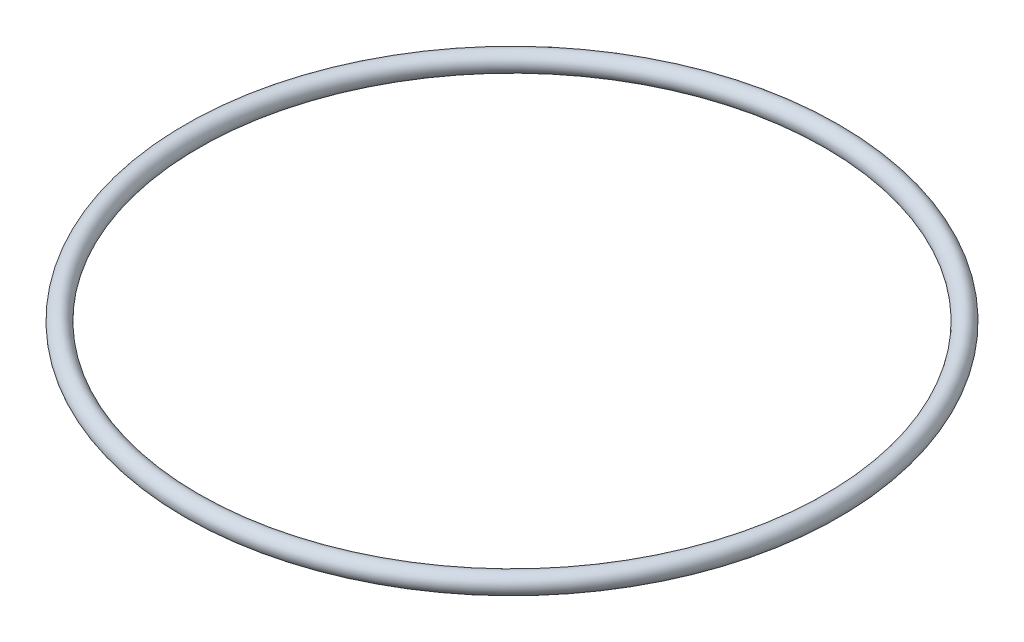
ISO-10303-21;
HEADER;
FILE_DESCRIPTION(('STEP AP214'),'2;1');
FILE_NAME('part.step','',(''),(''),'','','');
FILE_SCHEMA(('AUTOMOTIVE_DESIGN { 1 0 10303 214 1 1 1 1 }'));
ENDSEC;
DATA;
#1=APPLICATION_CONTEXT('core data for automotive mechanical design processes');
#2=APPLICATION_PROTOCOL_DEFINITION('international standard','automotive_design',2000,#1);
#3=PRODUCT_CONTEXT('',#1,'mechanical');
#4=PRODUCT('Part','Part','',(#3));
#5=PRODUCT_RELATED_PRODUCT_CATEGORY('part','',(#4));
#6=PRODUCT_DEFINITION_FORMATION('','',#4);
#7=PRODUCT_DEFINITION_CONTEXT('part definition',#1,'design');
#8=PRODUCT_DEFINITION('design','',#6,#7);
#9=PRODUCT_DEFINITION_SHAPE('','',#8);
#10=(LENGTH_UNIT() NAMED_UNIT(*) SI_UNIT(.MILLI.,.METRE.));
#11=(NAMED_UNIT(*) PLANE_ANGLE_UNIT() SI_UNIT($,.RADIAN.));
#12=(NAMED_UNIT(*) SI_UNIT($,.STERADIAN.) SOLID_ANGLE_UNIT());
#13=UNCERTAINTY_MEASURE_WITH_UNIT(LENGTH_MEASURE(1.E-05),#10,'distance_accuracy_value','');
#14=(GEOMETRIC_REPRESENTATION_CONTEXT(3) GLOBAL_UNCERTAINTY_ASSIGNED_CONTEXT((#13)) GLOBAL_UNIT_ASSIGNED_CONTEXT((#10,
#11,#12)) REPRESENTATION_CONTEXT('',''));
#15=CARTESIAN_POINT('',(0.,0.,0.));
#16=DIRECTION('',(0.,0.,1.));
#17=DIRECTION('',(1.,0.,0.));
#18=AXIS2_PLACEMENT_3D('',#15,#16,#17);
#19=CARTESIAN_POINT('',(-336.,0.,0.));
#20=DIRECTION('',(0.,-1.,0.));
#21=DIRECTION('',(0.,0.,-1.));
#22=AXIS2_PLACEMENT_3D('',#19,#20,#21);
#23=TOROIDAL_SURFACE('',#22,336.,10.);
#24=CARTESIAN_POINT('',(-336.,0.,-346.));
#25=VERTEX_POINT('',#24);
#26=VERTEX_LOOP('',#25);
#27=FACE_BOUND('',#26,.T.);
#28=ADVANCED_FACE('F35',(#27),#23,.T.);
#29=CLOSED_SHELL('',(#28));
#30=MANIFOLD_SOLID_BREP('B2',#29);
#31=ADVANCED_BREP_SHAPE_REPRESENTATION('',(#18,#30),#14);
#32=SHAPE_DEFINITION_REPRESENTATION(#9,#31);
ENDSEC;
END-ISO-10303-21;
